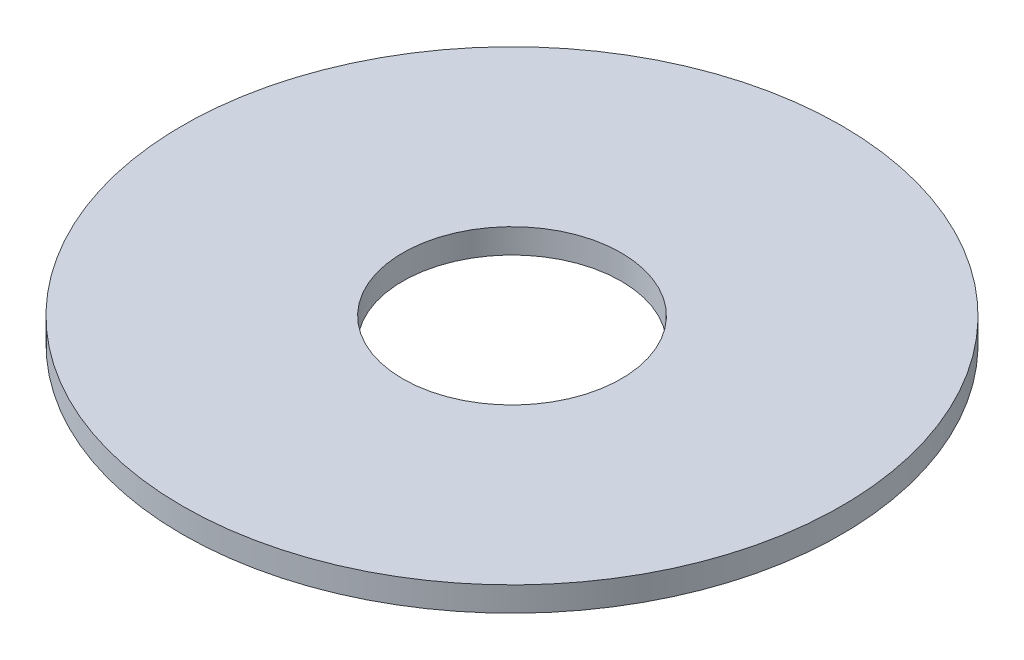
ISO-10303-21;
HEADER;
FILE_DESCRIPTION(('STEP AP214'),'2;1');
FILE_NAME('part.step','',(''),(''),'','','');
FILE_SCHEMA(('AUTOMOTIVE_DESIGN { 1 0 10303 214 1 1 1 1 }'));
ENDSEC;
DATA;
#1=APPLICATION_CONTEXT('core data for automotive mechanical design processes');
#2=APPLICATION_PROTOCOL_DEFINITION('international standard','automotive_design',2000,#1);
#3=PRODUCT_CONTEXT('',#1,'mechanical');
#4=PRODUCT('Part','Part','',(#3));
#5=PRODUCT_RELATED_PRODUCT_CATEGORY('part','',(#4));
#6=PRODUCT_DEFINITION_FORMATION('','',#4);
#7=PRODUCT_DEFINITION_CONTEXT('part definition',#1,'design');
#8=PRODUCT_DEFINITION('design','',#6,#7);
#9=PRODUCT_DEFINITION_SHAPE('','',#8);
#10=(LENGTH_UNIT() NAMED_UNIT(*) SI_UNIT(.MILLI.,.METRE.));
#11=(NAMED_UNIT(*) PLANE_ANGLE_UNIT() SI_UNIT($,.RADIAN.));
#12=(NAMED_UNIT(*) SI_UNIT($,.STERADIAN.) SOLID_ANGLE_UNIT());
#13=UNCERTAINTY_MEASURE_WITH_UNIT(LENGTH_MEASURE(1.E-05),#10,'distance_accuracy_value','');
#14=(GEOMETRIC_REPRESENTATION_CONTEXT(3) GLOBAL_UNCERTAINTY_ASSIGNED_CONTEXT((#13)) GLOBAL_UNIT_ASSIGNED_CONTEXT((#10,
#11,#12)) REPRESENTATION_CONTEXT('',''));
#15=CARTESIAN_POINT('',(0.,0.,0.));
#16=DIRECTION('',(0.,0.,1.));
#17=DIRECTION('',(1.,0.,0.));
#18=AXIS2_PLACEMENT_3D('',#15,#16,#17);
#19=CARTESIAN_POINT('',(0.,10.,0.));
#20=DIRECTION('',(0.,1.,0.));
#21=DIRECTION('',(0.,0.,1.));
#22=AXIS2_PLACEMENT_3D('',#19,#20,#21);
#23=PLANE('',#22);
#24=CARTESIAN_POINT('',(0.,10.,0.));
#25=DIRECTION('',(0.,1.,0.));
#26=DIRECTION('',(0.,0.,1.));
#27=AXIS2_PLACEMENT_3D('',#24,#25,#26);
#28=CIRCLE('',#27,134.275);
#29=CARTESIAN_POINT('',(0.,10.,134.275));
#30=VERTEX_POINT('',#29);
#31=EDGE_CURVE('E10',#30,#30,#28,.T.);
#32=ORIENTED_EDGE('',*,*,#31,.T.);
#33=EDGE_LOOP('',(#32));
#34=FACE_BOUND('',#33,.T.);
#35=CARTESIAN_POINT('',(0.,10.,0.));
#36=DIRECTION('',(0.,1.,0.));
#37=DIRECTION('',(0.,0.,1.));
#38=AXIS2_PLACEMENT_3D('',#35,#36,#37);
#39=CIRCLE('',#38,44.5);
#40=CARTESIAN_POINT('',(0.,10.,44.5));
#41=VERTEX_POINT('',#40);
#42=EDGE_CURVE('E42',#41,#41,#39,.T.);
#43=ORIENTED_EDGE('',*,*,#42,.F.);
#44=EDGE_LOOP('',(#43));
#45=FACE_BOUND('',#44,.T.);
#46=ADVANCED_FACE('F31',(#34,#45),#23,.T.);
#47=CARTESIAN_POINT('',(0.,0.,0.));
#48=DIRECTION('',(0.,1.,0.));
#49=DIRECTION('',(0.,0.,1.));
#50=AXIS2_PLACEMENT_3D('',#47,#48,#49);
#51=PLANE('',#50);
#52=CARTESIAN_POINT('',(0.,0.,0.));
#53=DIRECTION('',(0.,1.,0.));
#54=DIRECTION('',(0.,0.,1.));
#55=AXIS2_PLACEMENT_3D('',#52,#53,#54);
#56=CIRCLE('',#55,134.275);
#57=CARTESIAN_POINT('',(0.,0.,134.275));
#58=VERTEX_POINT('',#57);
#59=EDGE_CURVE('E35',#58,#58,#56,.T.);
#60=ORIENTED_EDGE('',*,*,#59,.F.);
#61=EDGE_LOOP('',(#60));
#62=FACE_BOUND('',#61,.T.);
#63=CARTESIAN_POINT('',(0.,0.,0.));
#64=DIRECTION('',(0.,1.,0.));
#65=DIRECTION('',(0.,0.,1.));
#66=AXIS2_PLACEMENT_3D('',#63,#64,#65);
#67=CIRCLE('',#66,44.5);
#68=CARTESIAN_POINT('',(0.,0.,44.5));
#69=VERTEX_POINT('',#68);
#70=EDGE_CURVE('E44',#69,#69,#67,.T.);
#71=ORIENTED_EDGE('',*,*,#70,.T.);
#72=EDGE_LOOP('',(#71));
#73=FACE_BOUND('',#72,.T.);
#74=ADVANCED_FACE('F54',(#62,#73),#51,.F.);
#75=CARTESIAN_POINT('',(0.,10.,0.));
#76=DIRECTION('',(0.,-1.,0.));
#77=DIRECTION('',(0.,0.,-1.));
#78=AXIS2_PLACEMENT_3D('',#75,#76,#77);
#79=CYLINDRICAL_SURFACE('',#78,134.275);
#80=ORIENTED_EDGE('',*,*,#31,.F.);
#81=EDGE_LOOP('',(#80));
#82=FACE_BOUND('',#81,.T.);
#83=ORIENTED_EDGE('',*,*,#59,.T.);
#84=EDGE_LOOP('',(#83));
#85=FACE_BOUND('',#84,.T.);
#86=ADVANCED_FACE('F33',(#82,#85),#79,.T.);
#87=CARTESIAN_POINT('',(0.,10.,0.));
#88=DIRECTION('',(0.,-1.,0.));
#89=DIRECTION('',(0.,0.,-1.));
#90=AXIS2_PLACEMENT_3D('',#87,#88,#89);
#91=CYLINDRICAL_SURFACE('',#90,44.5);
#92=ORIENTED_EDGE('',*,*,#42,.T.);
#93=EDGE_LOOP('',(#92));
#94=FACE_BOUND('',#93,.T.);
#95=ORIENTED_EDGE('',*,*,#70,.F.);
#96=EDGE_LOOP('',(#95));
#97=FACE_BOUND('',#96,.T.);
#98=ADVANCED_FACE('F50',(#94,#97),#91,.F.);
#99=CLOSED_SHELL('',(#46,#74,#86,#98));
#100=MANIFOLD_SOLID_BREP('B2',#99);
#101=ADVANCED_BREP_SHAPE_REPRESENTATION('',(#18,#100),#14);
#102=SHAPE_DEFINITION_REPRESENTATION(#9,#101);
ENDSEC;
END-ISO-10303-21;
